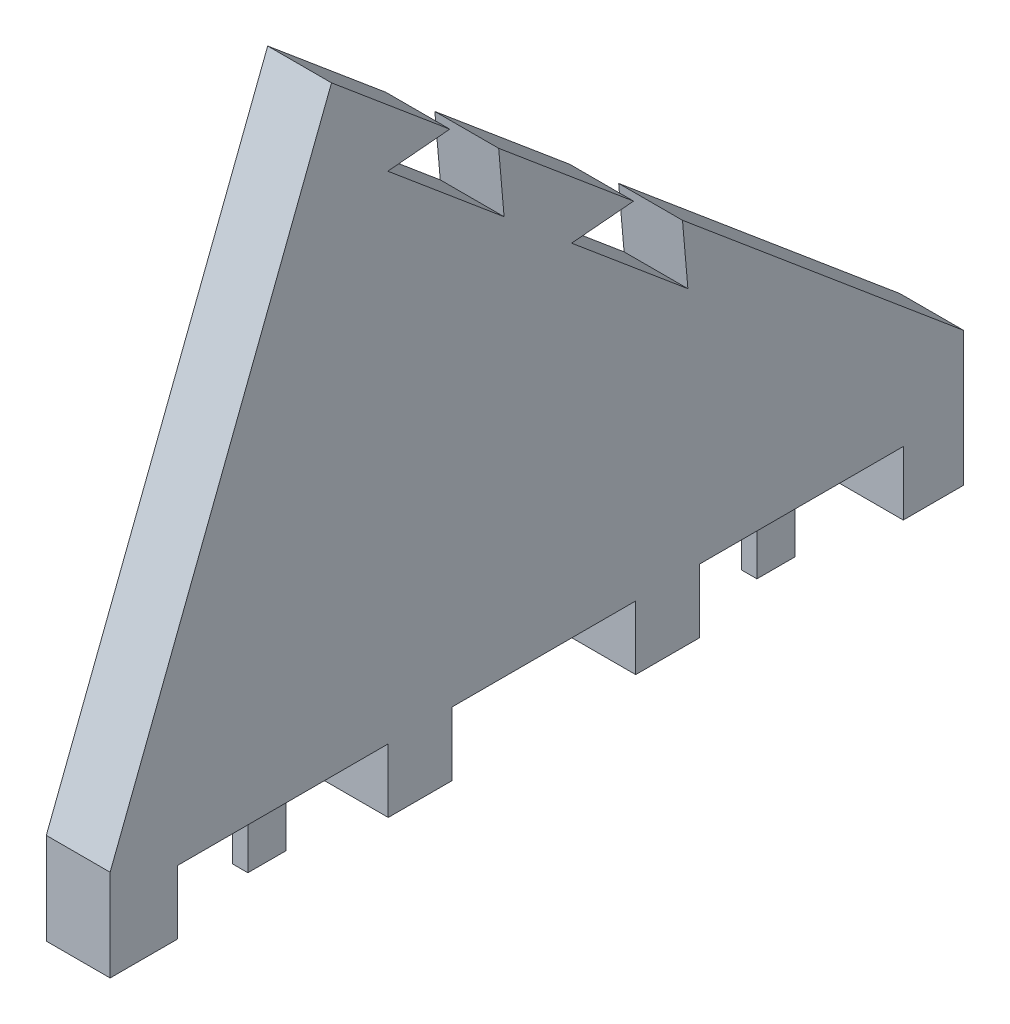
ISO-10303-21;
HEADER;
FILE_DESCRIPTION(('STEP AP214'),'2;1');
FILE_NAME('part.step','',(''),(''),'','','');
FILE_SCHEMA(('AUTOMOTIVE_DESIGN { 1 0 10303 214 1 1 1 1 }'));
ENDSEC;
DATA;
#1=APPLICATION_CONTEXT('core data for automotive mechanical design processes');
#2=APPLICATION_PROTOCOL_DEFINITION('international standard','automotive_design',2000,#1);
#3=PRODUCT_CONTEXT('',#1,'mechanical');
#4=PRODUCT('Part','Part','',(#3));
#5=PRODUCT_RELATED_PRODUCT_CATEGORY('part','',(#4));
#6=PRODUCT_DEFINITION_FORMATION('','',#4);
#7=PRODUCT_DEFINITION_CONTEXT('part definition',#1,'design');
#8=PRODUCT_DEFINITION('design','',#6,#7);
#9=PRODUCT_DEFINITION_SHAPE('','',#8);
#10=(LENGTH_UNIT() NAMED_UNIT(*) SI_UNIT(.MILLI.,.METRE.));
#11=(NAMED_UNIT(*) PLANE_ANGLE_UNIT() SI_UNIT($,.RADIAN.));
#12=(NAMED_UNIT(*) SI_UNIT($,.STERADIAN.) SOLID_ANGLE_UNIT());
#13=UNCERTAINTY_MEASURE_WITH_UNIT(LENGTH_MEASURE(1.E-05),#10,'distance_accuracy_value','');
#14=(GEOMETRIC_REPRESENTATION_CONTEXT(3) GLOBAL_UNCERTAINTY_ASSIGNED_CONTEXT((#13)) GLOBAL_UNIT_ASSIGNED_CONTEXT((#10,
#11,#12)) REPRESENTATION_CONTEXT('',''));
#15=CARTESIAN_POINT('',(0.,0.,0.));
#16=DIRECTION('',(0.,0.,1.));
#17=DIRECTION('',(1.,0.,0.));
#18=AXIS2_PLACEMENT_3D('',#15,#16,#17);
#19=CARTESIAN_POINT('',(5.,4.99883863747764,0.));
#20=DIRECTION('',(0.,1.,0.));
#21=DIRECTION('',(0.,0.,1.));
#22=AXIS2_PLACEMENT_3D('',#19,#20,#21);
#23=PLANE('',#22);
#24=DIRECTION('',(-1.,0.,0.));
#25=VECTOR('',#24,1.);
#26=CARTESIAN_POINT('',(3.25,4.99883863747764,-18.442857145));
#27=LINE('',#26,#25);
#28=CARTESIAN_POINT('',(3.25,4.99883863747764,-18.442857145));
#29=VERTEX_POINT('',#28);
#30=CARTESIAN_POINT('',(2.05,4.99883863747764,-18.442857145));
#31=VERTEX_POINT('',#30);
#32=EDGE_CURVE('E63',#29,#31,#27,.T.);
#33=ORIENTED_EDGE('',*,*,#32,.F.);
#34=DIRECTION('',(0.,0.,-1.));
#35=VECTOR('',#34,1.);
#36=CARTESIAN_POINT('',(3.25,4.99883863747764,0.));
#37=LINE('',#36,#35);
#38=CARTESIAN_POINT('',(3.25,4.99883863747764,-21.442857145));
#39=VERTEX_POINT('',#38);
#40=EDGE_CURVE('E305',#29,#39,#37,.T.);
#41=ORIENTED_EDGE('',*,*,#40,.T.);
#42=DIRECTION('',(-1.,0.,0.));
#43=VECTOR('',#42,1.);
#44=CARTESIAN_POINT('',(3.25,4.99883863747764,-21.442857145));
#45=LINE('',#44,#43);
#46=CARTESIAN_POINT('',(2.05,4.99883863747764,-21.442857145));
#47=VERTEX_POINT('',#46);
#48=EDGE_CURVE('E317',#39,#47,#45,.T.);
#49=ORIENTED_EDGE('',*,*,#48,.T.);
#50=DIRECTION('',(0.,0.,-1.));
#51=VECTOR('',#50,1.);
#52=CARTESIAN_POINT('',(2.05,4.99883863747764,0.));
#53=LINE('',#52,#51);
#54=EDGE_CURVE('E300',#31,#47,#53,.T.);
#55=ORIENTED_EDGE('',*,*,#54,.F.);
#56=EDGE_LOOP('',(#33,#41,#49,#55));
#57=FACE_BOUND('',#56,.T.);
#58=DIRECTION('',(0.,0.,-1.));
#59=VECTOR('',#58,1.);
#60=CARTESIAN_POINT('',(0.,4.99883863747764,0.));
#61=LINE('',#60,#59);
#62=CARTESIAN_POINT('',(0.,4.99883863747765,-12.192857145));
#63=VERTEX_POINT('',#62);
#64=CARTESIAN_POINT('',(0.,4.99883863747764,-28.1589092083321));
#65=VERTEX_POINT('',#64);
#66=EDGE_CURVE('E324',#63,#65,#61,.T.);
#67=ORIENTED_EDGE('',*,*,#66,.T.);
#68=DIRECTION('',(-1.,0.,0.));
#69=VECTOR('',#68,1.);
#70=CARTESIAN_POINT('',(5.,4.99883863747764,-28.1589092083321));
#71=LINE('',#70,#69);
#72=CARTESIAN_POINT('',(5.,4.99883863747764,-28.1589092083321));
#73=VERTEX_POINT('',#72);
#74=EDGE_CURVE('E11',#73,#65,#71,.T.);
#75=ORIENTED_EDGE('',*,*,#74,.F.);
#76=DIRECTION('',(0.,0.,-1.));
#77=VECTOR('',#76,1.);
#78=CARTESIAN_POINT('',(5.,4.99883863747764,0.));
#79=LINE('',#78,#77);
#80=CARTESIAN_POINT('',(5.,4.99883863747765,-12.192857145));
#81=VERTEX_POINT('',#80);
#82=EDGE_CURVE('E325',#81,#73,#79,.T.);
#83=ORIENTED_EDGE('',*,*,#82,.F.);
#84=DIRECTION('',(-1.,0.,0.));
#85=VECTOR('',#84,1.);
#86=CARTESIAN_POINT('',(5.,4.99883863747765,-12.192857145));
#87=LINE('',#86,#85);
#88=EDGE_CURVE('E388',#81,#63,#87,.T.);
#89=ORIENTED_EDGE('',*,*,#88,.T.);
#90=EDGE_LOOP('',(#67,#75,#83,#89));
#91=FACE_BOUND('',#90,.T.);
#92=ADVANCED_FACE('F41',(#57,#91),#23,.F.);
#93=CARTESIAN_POINT('',(5.,0.,-28.1589092083321));
#94=DIRECTION('',(0.,0.,-1.));
#95=DIRECTION('',(-1.,0.,0.));
#96=AXIS2_PLACEMENT_3D('',#93,#94,#95);
#97=PLANE('',#96);
#98=DIRECTION('',(0.,-1.,0.));
#99=VECTOR('',#98,1.);
#100=CARTESIAN_POINT('',(0.,0.,-28.1589092083321));
#101=LINE('',#100,#99);
#102=CARTESIAN_POINT('',(0.,0.00505467967505338,-28.1589092083321));
#103=VERTEX_POINT('',#102);
#104=EDGE_CURVE('E391',#65,#103,#101,.T.);
#105=ORIENTED_EDGE('',*,*,#104,.T.);
#106=DIRECTION('',(-1.,0.,0.));
#107=VECTOR('',#106,1.);
#108=CARTESIAN_POINT('',(5.,0.00505467967505338,-28.1589092083321));
#109=LINE('',#108,#107);
#110=CARTESIAN_POINT('',(5.,0.00505467967505338,-28.1589092083321));
#111=VERTEX_POINT('',#110);
#112=EDGE_CURVE('E48',#111,#103,#109,.T.);
#113=ORIENTED_EDGE('',*,*,#112,.F.);
#114=DIRECTION('',(0.,-1.,0.));
#115=VECTOR('',#114,1.);
#116=CARTESIAN_POINT('',(5.,0.,-28.1589092083321));
#117=LINE('',#116,#115);
#118=EDGE_CURVE('E328',#73,#111,#117,.T.);
#119=ORIENTED_EDGE('',*,*,#118,.F.);
#120=ORIENTED_EDGE('',*,*,#74,.T.);
#121=EDGE_LOOP('',(#105,#113,#119,#120));
#122=FACE_BOUND('',#121,.T.);
#123=ADVANCED_FACE('F528',(#122),#97,.F.);
#124=CARTESIAN_POINT('',(5.,0.00505467967505585,0.));
#125=DIRECTION('',(0.,1.,0.));
#126=DIRECTION('',(0.,0.,1.));
#127=AXIS2_PLACEMENT_3D('',#124,#125,#126);
#128=PLANE('',#127);
#129=DIRECTION('',(0.,0.,-1.));
#130=VECTOR('',#129,1.);
#131=CARTESIAN_POINT('',(0.,0.00505467967505585,0.));
#132=LINE('',#131,#130);
#133=CARTESIAN_POINT('',(0.,0.00505467967505296,-32.892857145));
#134=VERTEX_POINT('',#133);
#135=EDGE_CURVE('E393',#103,#134,#132,.T.);
#136=ORIENTED_EDGE('',*,*,#135,.T.);
#137=DIRECTION('',(-1.,0.,0.));
#138=VECTOR('',#137,1.);
#139=CARTESIAN_POINT('',(5.,0.00505467967505296,-32.892857145));
#140=LINE('',#139,#138);
#141=CARTESIAN_POINT('',(5.,0.00505467967505296,-32.892857145));
#142=VERTEX_POINT('',#141);
#143=EDGE_CURVE('E503',#142,#134,#140,.T.);
#144=ORIENTED_EDGE('',*,*,#143,.F.);
#145=DIRECTION('',(0.,0.,-1.));
#146=VECTOR('',#145,1.);
#147=CARTESIAN_POINT('',(5.,0.00505467967505585,0.));
#148=LINE('',#147,#146);
#149=EDGE_CURVE('E331',#111,#142,#148,.T.);
#150=ORIENTED_EDGE('',*,*,#149,.F.);
#151=ORIENTED_EDGE('',*,*,#112,.T.);
#152=EDGE_LOOP('',(#136,#144,#150,#151));
#153=FACE_BOUND('',#152,.T.);
#154=ADVANCED_FACE('F510',(#153),#128,.F.);
#155=CARTESIAN_POINT('',(5.,0.,-32.892857145));
#156=DIRECTION('',(0.,0.,1.));
#157=DIRECTION('',(1.,0.,0.));
#158=AXIS2_PLACEMENT_3D('',#155,#156,#157);
#159=PLANE('',#158);
#160=DIRECTION('',(0.,1.,0.));
#161=VECTOR('',#160,1.);
#162=CARTESIAN_POINT('',(0.,0.,-32.892857145));
#163=LINE('',#162,#161);
#164=CARTESIAN_POINT('',(0.,10.5094533457025,-32.892857145));
#165=VERTEX_POINT('',#164);
#166=EDGE_CURVE('E395',#134,#165,#163,.T.);
#167=ORIENTED_EDGE('',*,*,#166,.T.);
#168=DIRECTION('',(-1.,0.,0.));
#169=VECTOR('',#168,1.);
#170=CARTESIAN_POINT('',(5.,10.5094533457025,-32.892857145));
#171=LINE('',#170,#169);
#172=CARTESIAN_POINT('',(5.,10.5094533457025,-32.892857145));
#173=VERTEX_POINT('',#172);
#174=EDGE_CURVE('E501',#173,#165,#171,.T.);
#175=ORIENTED_EDGE('',*,*,#174,.F.);
#176=DIRECTION('',(0.,1.,0.));
#177=VECTOR('',#176,1.);
#178=CARTESIAN_POINT('',(5.,0.,-32.892857145));
#179=LINE('',#178,#177);
#180=EDGE_CURVE('E333',#142,#173,#179,.T.);
#181=ORIENTED_EDGE('',*,*,#180,.F.);
#182=ORIENTED_EDGE('',*,*,#143,.T.);
#183=EDGE_LOOP('',(#167,#175,#181,#182));
#184=FACE_BOUND('',#183,.T.);
#185=ADVANCED_FACE('F521',(#184),#159,.F.);
#186=CARTESIAN_POINT('',(5.,22.3637707512892,-18.7654317891398));
#187=DIRECTION('',(0.,0.766044443118982,-0.642787609686534));
#188=DIRECTION('',(0.,0.642787609686534,0.766044443118982));
#189=AXIS2_PLACEMENT_3D('',#186,#187,#188);
#190=PLANE('',#189);
#191=DIRECTION('',(0.,-0.642787609686534,-0.766044443118982));
#192=VECTOR('',#191,1.);
#193=CARTESIAN_POINT('',(0.,22.3637707512892,-18.7654317891398));
#194=LINE('',#193,#192);
#195=CARTESIAN_POINT('',(0.,28.9974016846058,-10.8597782924156));
#196=VERTEX_POINT('',#195);
#197=EDGE_CURVE('E398',#196,#165,#194,.T.);
#198=ORIENTED_EDGE('',*,*,#197,.F.);
#199=DIRECTION('',(-1.,0.,0.));
#200=VECTOR('',#199,1.);
#201=CARTESIAN_POINT('',(5.,28.9974016846058,-10.8597782924156));
#202=LINE('',#201,#200);
#203=CARTESIAN_POINT('',(5.,28.9974016846058,-10.8597782924156));
#204=VERTEX_POINT('',#203);
#205=EDGE_CURVE('E499',#204,#196,#202,.T.);
#206=ORIENTED_EDGE('',*,*,#205,.F.);
#207=DIRECTION('',(0.,-0.642787609686534,-0.766044443118982));
#208=VECTOR('',#207,1.);
#209=CARTESIAN_POINT('',(5.,22.3637707512892,-18.7654317891398));
#210=LINE('',#209,#208);
#211=EDGE_CURVE('E335',#204,#173,#210,.T.);
#212=ORIENTED_EDGE('',*,*,#211,.T.);
#213=ORIENTED_EDGE('',*,*,#174,.T.);
#214=EDGE_LOOP('',(#198,#206,#212,#213));
#215=FACE_BOUND('',#214,.T.);
#216=ADVANCED_FACE('F615',(#215),#190,.T.);
#217=CARTESIAN_POINT('',(5.,1.16315819937103,-13.2949590551943));
#218=DIRECTION('',(0.,0.0871557427476729,-0.996194698091744));
#219=DIRECTION('',(0.,0.996194698091744,0.0871557427476729));
#220=AXIS2_PLACEMENT_3D('',#217,#218,#219);
#221=PLANE('',#220);
#222=DIRECTION('',(0.,-0.996194698091744,-0.0871557427476729));
#223=VECTOR('',#222,1.);
#224=CARTESIAN_POINT('',(0.,1.16315819937103,-13.2949590551943));
#225=LINE('',#224,#223);
#226=CARTESIAN_POINT('',(0.,24.1425242072763,-11.2845250344893));
#227=VERTEX_POINT('',#226);
#228=EDGE_CURVE('E401',#196,#227,#225,.T.);
#229=ORIENTED_EDGE('',*,*,#228,.T.);
#230=DIRECTION('',(-1.,0.,0.));
#231=VECTOR('',#230,1.);
#232=CARTESIAN_POINT('',(5.,24.1425242072763,-11.2845250344893));
#233=LINE('',#232,#231);
#234=CARTESIAN_POINT('',(5.,24.1425242072763,-11.2845250344893));
#235=VERTEX_POINT('',#234);
#236=EDGE_CURVE('E496',#235,#227,#233,.T.);
#237=ORIENTED_EDGE('',*,*,#236,.F.);
#238=DIRECTION('',(0.,-0.996194698091744,-0.0871557427476729));
#239=VECTOR('',#238,1.);
#240=CARTESIAN_POINT('',(5.,1.16315819937103,-13.2949590551943));
#241=LINE('',#240,#239);
#242=EDGE_CURVE('E338',#204,#235,#241,.T.);
#243=ORIENTED_EDGE('',*,*,#242,.F.);
#244=ORIENTED_EDGE('',*,*,#205,.T.);
#245=EDGE_LOOP('',(#229,#237,#243,#244));
#246=FACE_BOUND('',#245,.T.);
#247=ADVANCED_FACE('F617',(#246),#221,.F.);
#248=CARTESIAN_POINT('',(5.,19.7239586415876,-16.5503664215119));
#249=DIRECTION('',(0.,-0.766044443118983,0.642787609686534));
#250=DIRECTION('',(0.,-0.642787609686534,-0.766044443118983));
#251=AXIS2_PLACEMENT_3D('',#248,#249,#250);
#252=PLANE('',#251);
#253=DIRECTION('',(0.,0.642787609686534,0.766044443118983));
#254=VECTOR('',#253,1.);
#255=CARTESIAN_POINT('',(0.,19.7239586415876,-16.5503664215119));
#256=LINE('',#255,#254);
#257=CARTESIAN_POINT('',(0.,31.7865929909647,-2.17467859949115));
#258=VERTEX_POINT('',#257);
#259=EDGE_CURVE('E403',#227,#258,#256,.T.);
#260=ORIENTED_EDGE('',*,*,#259,.T.);
#261=DIRECTION('',(-1.,0.,0.));
#262=VECTOR('',#261,1.);
#263=CARTESIAN_POINT('',(5.,31.7865929909647,-2.17467859949115));
#264=LINE('',#263,#262);
#265=CARTESIAN_POINT('',(5.,31.7865929909647,-2.17467859949115));
#266=VERTEX_POINT('',#265);
#267=EDGE_CURVE('E493',#266,#258,#264,.T.);
#268=ORIENTED_EDGE('',*,*,#267,.F.);
#269=DIRECTION('',(0.,0.642787609686534,0.766044443118983));
#270=VECTOR('',#269,1.);
#271=CARTESIAN_POINT('',(5.,19.7239586415876,-16.5503664215119));
#272=LINE('',#271,#270);
#273=EDGE_CURVE('E340',#235,#266,#272,.T.);
#274=ORIENTED_EDGE('',*,*,#273,.F.);
#275=ORIENTED_EDGE('',*,*,#236,.T.);
#276=EDGE_LOOP('',(#260,#268,#274,#275));
#277=FACE_BOUND('',#276,.T.);
#278=ADVANCED_FACE('F611',(#277),#252,.F.);
#279=CARTESIAN_POINT('',(5.,31.3563236172487,2.74332284635948));
#280=DIRECTION('',(0.,0.996194698091745,0.0871557427476589));
#281=DIRECTION('',(0.,-0.0871557427476589,0.996194698091745));
#282=AXIS2_PLACEMENT_3D('',#279,#280,#281);
#283=PLANE('',#282);
#284=DIRECTION('',(0.,0.0871557427476589,-0.996194698091745));
#285=VECTOR('',#284,1.);
#286=CARTESIAN_POINT('',(0.,31.3563236172487,2.74332284635948));
#287=LINE('',#286,#285);
#288=CARTESIAN_POINT('',(0.,32.2113397330384,-7.02955607682063));
#289=VERTEX_POINT('',#288);
#290=EDGE_CURVE('E405',#258,#289,#287,.T.);
#291=ORIENTED_EDGE('',*,*,#290,.T.);
#292=DIRECTION('',(-1.,0.,0.));
#293=VECTOR('',#292,1.);
#294=CARTESIAN_POINT('',(5.,32.2113397330384,-7.02955607682063));
#295=LINE('',#294,#293);
#296=CARTESIAN_POINT('',(5.,32.2113397330384,-7.02955607682063));
#297=VERTEX_POINT('',#296);
#298=EDGE_CURVE('E491',#297,#289,#295,.T.);
#299=ORIENTED_EDGE('',*,*,#298,.F.);
#300=DIRECTION('',(0.,0.0871557427476589,-0.996194698091745));
#301=VECTOR('',#300,1.);
#302=CARTESIAN_POINT('',(5.,31.3563236172487,2.74332284635948));
#303=LINE('',#302,#301);
#304=EDGE_CURVE('E342',#266,#297,#303,.T.);
#305=ORIENTED_EDGE('',*,*,#304,.F.);
#306=ORIENTED_EDGE('',*,*,#267,.T.);
#307=EDGE_LOOP('',(#291,#299,#305,#306));
#308=FACE_BOUND('',#307,.T.);
#309=ADVANCED_FACE('F607',(#308),#283,.F.);
#310=CARTESIAN_POINT('',(5.,22.3637707512892,-18.7654317891398));
#311=DIRECTION('',(0.,0.766044443118983,-0.642787609686534));
#312=DIRECTION('',(0.,0.642787609686534,0.766044443118983));
#313=AXIS2_PLACEMENT_3D('',#310,#311,#312);
#314=PLANE('',#313);
#315=DIRECTION('',(0.,-0.642787609686534,-0.766044443118983));
#316=VECTOR('',#315,1.);
#317=CARTESIAN_POINT('',(0.,22.3637707512892,-18.7654317891398));
#318=LINE('',#317,#316);
#319=CARTESIAN_POINT('',(0.,41.0818087467126,3.54185723822133));
#320=VERTEX_POINT('',#319);
#321=EDGE_CURVE('E408',#320,#289,#318,.T.);
#322=ORIENTED_EDGE('',*,*,#321,.F.);
#323=DIRECTION('',(-1.,0.,0.));
#324=VECTOR('',#323,1.);
#325=CARTESIAN_POINT('',(5.,41.0818087467126,3.54185723822133));
#326=LINE('',#325,#324);
#327=CARTESIAN_POINT('',(5.,41.0818087467126,3.54185723822133));
#328=VERTEX_POINT('',#327);
#329=EDGE_CURVE('E489',#328,#320,#326,.T.);
#330=ORIENTED_EDGE('',*,*,#329,.F.);
#331=DIRECTION('',(0.,-0.642787609686534,-0.766044443118983));
#332=VECTOR('',#331,1.);
#333=CARTESIAN_POINT('',(5.,22.3637707512892,-18.7654317891398));
#334=LINE('',#333,#332);
#335=EDGE_CURVE('E344',#328,#297,#334,.T.);
#336=ORIENTED_EDGE('',*,*,#335,.T.);
#337=ORIENTED_EDGE('',*,*,#298,.T.);
#338=EDGE_LOOP('',(#322,#330,#336,#337));
#339=FACE_BOUND('',#338,.T.);
#340=ADVANCED_FACE('F602',(#339),#314,.T.);
#341=CARTESIAN_POINT('',(5.,0.00454396510591041,-0.0519377588224709));
#342=DIRECTION('',(0.,-0.0871557427476708,0.996194698091744));
#343=DIRECTION('',(0.,-0.996194698091744,-0.0871557427476708));
#344=AXIS2_PLACEMENT_3D('',#341,#342,#343);
#345=PLANE('',#344);
#346=DIRECTION('',(0.,0.996194698091744,0.0871557427476708));
#347=VECTOR('',#346,1.);
#348=CARTESIAN_POINT('',(0.,0.00454396510591041,-0.0519377588224709));
#349=LINE('',#348,#347);
#350=CARTESIAN_POINT('',(0.,36.2269312693831,3.1171104961476));
#351=VERTEX_POINT('',#350);
#352=EDGE_CURVE('E411',#351,#320,#349,.T.);
#353=ORIENTED_EDGE('',*,*,#352,.F.);
#354=DIRECTION('',(-1.,0.,0.));
#355=VECTOR('',#354,1.);
#356=CARTESIAN_POINT('',(5.,36.2269312693831,3.1171104961476));
#357=LINE('',#356,#355);
#358=CARTESIAN_POINT('',(5.,36.2269312693831,3.1171104961476));
#359=VERTEX_POINT('',#358);
#360=EDGE_CURVE('E487',#359,#351,#357,.T.);
#361=ORIENTED_EDGE('',*,*,#360,.F.);
#362=DIRECTION('',(0.,0.996194698091744,0.0871557427476708));
#363=VECTOR('',#362,1.);
#364=CARTESIAN_POINT('',(5.,0.00454396510591041,-0.0519377588224709));
#365=LINE('',#364,#363);
#366=EDGE_CURVE('E347',#359,#328,#365,.T.);
#367=ORIENTED_EDGE('',*,*,#366,.T.);
#368=ORIENTED_EDGE('',*,*,#329,.T.);
#369=EDGE_LOOP('',(#353,#361,#367,#368));
#370=FACE_BOUND('',#369,.T.);
#371=ADVANCED_FACE('F597',(#370),#345,.T.);
#372=CARTESIAN_POINT('',(5.,19.7239586415876,-16.5503664215119));
#373=DIRECTION('',(0.,0.766044443118982,-0.642787609686534));
#374=DIRECTION('',(0.,0.642787609686534,0.766044443118982));
#375=AXIS2_PLACEMENT_3D('',#372,#373,#374);
#376=PLANE('',#375);
#377=DIRECTION('',(0.,-0.642787609686534,-0.766044443118982));
#378=VECTOR('',#377,1.);
#379=CARTESIAN_POINT('',(0.,19.7239586415876,-16.5503664215119));
#380=LINE('',#379,#378);
#381=CARTESIAN_POINT('',(0.,43.8710000530716,12.2269569311457));
#382=VERTEX_POINT('',#381);
#383=EDGE_CURVE('E414',#382,#351,#380,.T.);
#384=ORIENTED_EDGE('',*,*,#383,.F.);
#385=DIRECTION('',(-1.,0.,0.));
#386=VECTOR('',#385,1.);
#387=CARTESIAN_POINT('',(5.,43.8710000530716,12.2269569311457));
#388=LINE('',#387,#386);
#389=CARTESIAN_POINT('',(5.,43.8710000530716,12.2269569311457));
#390=VERTEX_POINT('',#389);
#391=EDGE_CURVE('E485',#390,#382,#388,.T.);
#392=ORIENTED_EDGE('',*,*,#391,.F.);
#393=DIRECTION('',(0.,-0.642787609686534,-0.766044443118982));
#394=VECTOR('',#393,1.);
#395=CARTESIAN_POINT('',(5.,19.7239586415876,-16.5503664215119));
#396=LINE('',#395,#394);
#397=EDGE_CURVE('E350',#390,#359,#396,.T.);
#398=ORIENTED_EDGE('',*,*,#397,.T.);
#399=ORIENTED_EDGE('',*,*,#360,.T.);
#400=EDGE_LOOP('',(#384,#392,#398,#399));
#401=FACE_BOUND('',#400,.T.);
#402=ADVANCED_FACE('F593',(#401),#376,.T.);
#403=CARTESIAN_POINT('',(5.,44.5993449136205,3.90193708062447));
#404=DIRECTION('',(0.,-0.996194698091745,-0.0871557427476602));
#405=DIRECTION('',(0.,0.0871557427476602,-0.996194698091745));
#406=AXIS2_PLACEMENT_3D('',#403,#404,#405);
#407=PLANE('',#406);
#408=DIRECTION('',(0.,-0.0871557427476602,0.996194698091745));
#409=VECTOR('',#408,1.);
#410=CARTESIAN_POINT('',(0.,44.5993449136205,3.90193708062447));
#411=LINE('',#410,#409);
#412=CARTESIAN_POINT('',(0.,44.2957467951453,7.37207945381625));
#413=VERTEX_POINT('',#412);
#414=EDGE_CURVE('E417',#413,#382,#411,.T.);
#415=ORIENTED_EDGE('',*,*,#414,.F.);
#416=DIRECTION('',(-1.,0.,0.));
#417=VECTOR('',#416,1.);
#418=CARTESIAN_POINT('',(5.,44.2957467951453,7.37207945381625));
#419=LINE('',#418,#417);
#420=CARTESIAN_POINT('',(5.,44.2957467951453,7.37207945381625));
#421=VERTEX_POINT('',#420);
#422=EDGE_CURVE('E483',#421,#413,#419,.T.);
#423=ORIENTED_EDGE('',*,*,#422,.F.);
#424=DIRECTION('',(0.,-0.0871557427476602,0.996194698091745));
#425=VECTOR('',#424,1.);
#426=CARTESIAN_POINT('',(5.,44.5993449136205,3.90193708062447));
#427=LINE('',#426,#425);
#428=EDGE_CURVE('E353',#421,#390,#427,.T.);
#429=ORIENTED_EDGE('',*,*,#428,.T.);
#430=ORIENTED_EDGE('',*,*,#391,.T.);
#431=EDGE_LOOP('',(#415,#423,#429,#430));
#432=FACE_BOUND('',#431,.T.);
#433=ADVANCED_FACE('F589',(#432),#407,.T.);
#434=CARTESIAN_POINT('',(5.,22.3637707512892,-18.7654317891397));
#435=DIRECTION('',(0.,0.766044443118983,-0.642787609686534));
#436=DIRECTION('',(0.,0.642787609686534,0.766044443118983));
#437=AXIS2_PLACEMENT_3D('',#434,#435,#436);
#438=PLANE('',#437);
#439=DIRECTION('',(0.,-0.642787609686534,-0.766044443118983));
#440=VECTOR('',#439,1.);
#441=CARTESIAN_POINT('',(0.,22.3637707512892,-18.7654317891397));
#442=LINE('',#441,#440);
#443=CARTESIAN_POINT('',(0.,52.0711838150504,16.6384844562784));
#444=VERTEX_POINT('',#443);
#445=EDGE_CURVE('E420',#444,#413,#442,.T.);
#446=ORIENTED_EDGE('',*,*,#445,.F.);
#447=DIRECTION('',(-1.,0.,0.));
#448=VECTOR('',#447,1.);
#449=CARTESIAN_POINT('',(5.,52.0711838150504,16.6384844562784));
#450=LINE('',#449,#448);
#451=CARTESIAN_POINT('',(5.,52.0711838150504,16.6384844562784));
#452=VERTEX_POINT('',#451);
#453=EDGE_CURVE('E481',#452,#444,#450,.T.);
#454=ORIENTED_EDGE('',*,*,#453,.F.);
#455=DIRECTION('',(0.,-0.642787609686534,-0.766044443118983));
#456=VECTOR('',#455,1.);
#457=CARTESIAN_POINT('',(5.,22.3637707512892,-18.7654317891397));
#458=LINE('',#457,#456);
#459=EDGE_CURVE('E356',#452,#421,#458,.T.);
#460=ORIENTED_EDGE('',*,*,#459,.T.);
#461=ORIENTED_EDGE('',*,*,#422,.T.);
#462=EDGE_LOOP('',(#446,#454,#460,#461));
#463=FACE_BOUND('',#462,.T.);
#464=ADVANCED_FACE('F585',(#463),#438,.T.);
#465=CARTESIAN_POINT('',(5.,12.358442577524,31.983506920508));
#466=DIRECTION('',(0.,0.360429186226386,0.932786578867956));
#467=DIRECTION('',(0.,-0.932786578867956,0.360429186226386));
#468=AXIS2_PLACEMENT_3D('',#465,#466,#467);
#469=PLANE('',#468);
#470=DIRECTION('',(0.,0.932786578867956,-0.360429186226386));
#471=VECTOR('',#470,1.);
#472=CARTESIAN_POINT('',(0.,12.358442577524,31.983506920508));
#473=LINE('',#472,#471);
#474=CARTESIAN_POINT('',(0.,7.18217750491239,33.9836182536681));
#475=VERTEX_POINT('',#474);
#476=EDGE_CURVE('E423',#475,#444,#473,.T.);
#477=ORIENTED_EDGE('',*,*,#476,.F.);
#478=DIRECTION('',(-1.,0.,0.));
#479=VECTOR('',#478,1.);
#480=CARTESIAN_POINT('',(5.,7.18217750491239,33.9836182536681));
#481=LINE('',#480,#479);
#482=CARTESIAN_POINT('',(5.,7.18217750491239,33.9836182536681));
#483=VERTEX_POINT('',#482);
#484=EDGE_CURVE('E479',#483,#475,#481,.T.);
#485=ORIENTED_EDGE('',*,*,#484,.F.);
#486=DIRECTION('',(0.,0.932786578867956,-0.360429186226386));
#487=VECTOR('',#486,1.);
#488=CARTESIAN_POINT('',(5.,12.358442577524,31.983506920508));
#489=LINE('',#488,#487);
#490=EDGE_CURVE('E359',#483,#452,#489,.T.);
#491=ORIENTED_EDGE('',*,*,#490,.T.);
#492=ORIENTED_EDGE('',*,*,#453,.T.);
#493=EDGE_LOOP('',(#477,#485,#491,#492));
#494=FACE_BOUND('',#493,.T.);
#495=ADVANCED_FACE('F581',(#494),#469,.T.);
#496=CARTESIAN_POINT('',(5.,0.,33.9836182536681));
#497=DIRECTION('',(0.,0.,-1.));
#498=DIRECTION('',(-1.,0.,0.));
#499=AXIS2_PLACEMENT_3D('',#496,#497,#498);
#500=PLANE('',#499);
#501=DIRECTION('',(0.,-1.,0.));
#502=VECTOR('',#501,1.);
#503=CARTESIAN_POINT('',(0.,0.,33.9836182536681));
#504=LINE('',#503,#502);
#505=CARTESIAN_POINT('',(0.,0.00505467967505297,33.9836182536681));
#506=VERTEX_POINT('',#505);
#507=EDGE_CURVE('E426',#475,#506,#504,.T.);
#508=ORIENTED_EDGE('',*,*,#507,.T.);
#509=DIRECTION('',(-1.,0.,0.));
#510=VECTOR('',#509,1.);
#511=CARTESIAN_POINT('',(5.,0.00505467967505297,33.9836182536681));
#512=LINE('',#511,#510);
#513=CARTESIAN_POINT('',(5.,0.00505467967505297,33.9836182536681));
#514=VERTEX_POINT('',#513);
#515=EDGE_CURVE('E476',#514,#506,#512,.T.);
#516=ORIENTED_EDGE('',*,*,#515,.F.);
#517=DIRECTION('',(0.,-1.,0.));
#518=VECTOR('',#517,1.);
#519=CARTESIAN_POINT('',(5.,0.,33.9836182536681));
#520=LINE('',#519,#518);
#521=EDGE_CURVE('E362',#483,#514,#520,.T.);
#522=ORIENTED_EDGE('',*,*,#521,.F.);
#523=ORIENTED_EDGE('',*,*,#484,.T.);
#524=EDGE_LOOP('',(#508,#516,#522,#523));
#525=FACE_BOUND('',#524,.T.);
#526=ADVANCED_FACE('F577',(#525),#500,.F.);
#527=CARTESIAN_POINT('',(5.,0.00505467967505294,0.));
#528=DIRECTION('',(0.,1.,0.));
#529=DIRECTION('',(0.,0.,1.));
#530=AXIS2_PLACEMENT_3D('',#527,#528,#529);
#531=PLANE('',#530);
#532=DIRECTION('',(0.,0.,-1.));
#533=VECTOR('',#532,1.);
#534=CARTESIAN_POINT('',(0.,0.00505467967505294,0.));
#535=LINE('',#534,#533);
#536=CARTESIAN_POINT('',(0.,0.00505467967505335,28.6919277339166));
#537=VERTEX_POINT('',#536);
#538=EDGE_CURVE('E428',#506,#537,#535,.T.);
#539=ORIENTED_EDGE('',*,*,#538,.T.);
#540=DIRECTION('',(-1.,0.,0.));
#541=VECTOR('',#540,1.);
#542=CARTESIAN_POINT('',(5.,0.00505467967505335,28.6919277339166));
#543=LINE('',#542,#541);
#544=CARTESIAN_POINT('',(5.,0.00505467967505335,28.6919277339166));
#545=VERTEX_POINT('',#544);
#546=EDGE_CURVE('E474',#545,#537,#543,.T.);
#547=ORIENTED_EDGE('',*,*,#546,.F.);
#548=DIRECTION('',(0.,0.,-1.));
#549=VECTOR('',#548,1.);
#550=CARTESIAN_POINT('',(5.,0.00505467967505294,0.));
#551=LINE('',#550,#549);
#552=EDGE_CURVE('E364',#514,#545,#551,.T.);
#553=ORIENTED_EDGE('',*,*,#552,.F.);
#554=ORIENTED_EDGE('',*,*,#515,.T.);
#555=EDGE_LOOP('',(#539,#547,#553,#554));
#556=FACE_BOUND('',#555,.T.);
#557=ADVANCED_FACE('F573',(#556),#531,.F.);
#558=CARTESIAN_POINT('',(5.,0.,28.6919277339166));
#559=DIRECTION('',(0.,0.,-1.));
#560=DIRECTION('',(-1.,0.,0.));
#561=AXIS2_PLACEMENT_3D('',#558,#559,#560);
#562=PLANE('',#561);
#563=DIRECTION('',(0.,-1.,0.));
#564=VECTOR('',#563,1.);
#565=CARTESIAN_POINT('',(0.,0.,28.6919277339166));
#566=LINE('',#565,#564);
#567=CARTESIAN_POINT('',(0.,4.99883863747764,28.6919277339166));
#568=VERTEX_POINT('',#567);
#569=EDGE_CURVE('E431',#568,#537,#566,.T.);
#570=ORIENTED_EDGE('',*,*,#569,.F.);
#571=DIRECTION('',(-1.,0.,0.));
#572=VECTOR('',#571,1.);
#573=CARTESIAN_POINT('',(5.,4.99883863747764,28.6919277339166));
#574=LINE('',#573,#572);
#575=CARTESIAN_POINT('',(5.,4.99883863747764,28.6919277339166));
#576=VERTEX_POINT('',#575);
#577=EDGE_CURVE('E472',#576,#568,#574,.T.);
#578=ORIENTED_EDGE('',*,*,#577,.F.);
#579=DIRECTION('',(0.,-1.,0.));
#580=VECTOR('',#579,1.);
#581=CARTESIAN_POINT('',(5.,0.,28.6919277339166));
#582=LINE('',#581,#580);
#583=EDGE_CURVE('E366',#576,#545,#582,.T.);
#584=ORIENTED_EDGE('',*,*,#583,.T.);
#585=ORIENTED_EDGE('',*,*,#546,.T.);
#586=EDGE_LOOP('',(#570,#578,#584,#585));
#587=FACE_BOUND('',#586,.T.);
#588=ADVANCED_FACE('F568',(#587),#562,.T.);
#589=CARTESIAN_POINT('',(5.,4.99883863747764,0.));
#590=DIRECTION('',(0.,-1.,0.));
#591=DIRECTION('',(0.,0.,-1.));
#592=AXIS2_PLACEMENT_3D('',#589,#590,#591);
#593=PLANE('',#592);
#594=DIRECTION('',(0.,0.,1.));
#595=VECTOR('',#594,1.);
#596=CARTESIAN_POINT('',(3.25,4.99883863747764,0.));
#597=LINE('',#596,#595);
#598=CARTESIAN_POINT('',(3.25,4.99883863747764,18.442857145));
#599=VERTEX_POINT('',#598);
#600=CARTESIAN_POINT('',(3.25,4.99883863747764,21.442857145));
#601=VERTEX_POINT('',#600);
#602=EDGE_CURVE('E261',#599,#601,#597,.T.);
#603=ORIENTED_EDGE('',*,*,#602,.F.);
#604=DIRECTION('',(-1.,0.,0.));
#605=VECTOR('',#604,1.);
#606=CARTESIAN_POINT('',(3.25,4.99883863747764,18.442857145));
#607=LINE('',#606,#605);
#608=CARTESIAN_POINT('',(2.05,4.99883863747764,18.442857145));
#609=VERTEX_POINT('',#608);
#610=EDGE_CURVE('E270',#599,#609,#607,.T.);
#611=ORIENTED_EDGE('',*,*,#610,.T.);
#612=DIRECTION('',(0.,0.,1.));
#613=VECTOR('',#612,1.);
#614=CARTESIAN_POINT('',(2.05,4.99883863747764,0.));
#615=LINE('',#614,#613);
#616=CARTESIAN_POINT('',(2.05,4.99883863747764,21.442857145));
#617=VERTEX_POINT('',#616);
#618=EDGE_CURVE('E289',#609,#617,#615,.T.);
#619=ORIENTED_EDGE('',*,*,#618,.T.);
#620=DIRECTION('',(-1.,0.,0.));
#621=VECTOR('',#620,1.);
#622=CARTESIAN_POINT('',(3.25,4.99883863747764,21.442857145));
#623=LINE('',#622,#621);
#624=EDGE_CURVE('E277',#601,#617,#623,.T.);
#625=ORIENTED_EDGE('',*,*,#624,.F.);
#626=EDGE_LOOP('',(#603,#611,#619,#625));
#627=FACE_BOUND('',#626,.T.);
#628=DIRECTION('',(0.,0.,1.));
#629=VECTOR('',#628,1.);
#630=CARTESIAN_POINT('',(0.,4.99883863747764,0.));
#631=LINE('',#630,#629);
#632=CARTESIAN_POINT('',(0.,4.99883863747764,12.192857145));
#633=VERTEX_POINT('',#632);
#634=EDGE_CURVE('E434',#633,#568,#631,.T.);
#635=ORIENTED_EDGE('',*,*,#634,.F.);
#636=DIRECTION('',(-1.,0.,0.));
#637=VECTOR('',#636,1.);
#638=CARTESIAN_POINT('',(5.,4.99883863747764,12.192857145));
#639=LINE('',#638,#637);
#640=CARTESIAN_POINT('',(5.,4.99883863747764,12.192857145));
#641=VERTEX_POINT('',#640);
#642=EDGE_CURVE('E470',#641,#633,#639,.T.);
#643=ORIENTED_EDGE('',*,*,#642,.F.);
#644=DIRECTION('',(0.,0.,1.));
#645=VECTOR('',#644,1.);
#646=CARTESIAN_POINT('',(5.,4.99883863747764,0.));
#647=LINE('',#646,#645);
#648=EDGE_CURVE('E369',#641,#576,#647,.T.);
#649=ORIENTED_EDGE('',*,*,#648,.T.);
#650=ORIENTED_EDGE('',*,*,#577,.T.);
#651=EDGE_LOOP('',(#635,#643,#649,#650));
#652=FACE_BOUND('',#651,.T.);
#653=ADVANCED_FACE('F280',(#627,#652),#593,.T.);
#654=CARTESIAN_POINT('',(5.,0.,12.192857145));
#655=DIRECTION('',(0.,0.,1.));
#656=DIRECTION('',(1.,0.,0.));
#657=AXIS2_PLACEMENT_3D('',#654,#655,#656);
#658=PLANE('',#657);
#659=DIRECTION('',(0.,1.,0.));
#660=VECTOR('',#659,1.);
#661=CARTESIAN_POINT('',(0.,0.,12.192857145));
#662=LINE('',#661,#660);
#663=CARTESIAN_POINT('',(0.,4.16328420696499E-06,12.192857145));
#664=VERTEX_POINT('',#663);
#665=EDGE_CURVE('E437',#664,#633,#662,.T.);
#666=ORIENTED_EDGE('',*,*,#665,.F.);
#667=DIRECTION('',(-1.,0.,0.));
#668=VECTOR('',#667,1.);
#669=CARTESIAN_POINT('',(5.,4.16328420696499E-06,12.192857145));
#670=LINE('',#669,#668);
#671=CARTESIAN_POINT('',(5.,4.16328420696499E-06,12.192857145));
#672=VERTEX_POINT('',#671);
#673=EDGE_CURVE('E468',#672,#664,#670,.T.);
#674=ORIENTED_EDGE('',*,*,#673,.F.);
#675=DIRECTION('',(0.,1.,0.));
#676=VECTOR('',#675,1.);
#677=CARTESIAN_POINT('',(5.,0.,12.192857145));
#678=LINE('',#677,#676);
#679=EDGE_CURVE('E372',#672,#641,#678,.T.);
#680=ORIENTED_EDGE('',*,*,#679,.T.);
#681=ORIENTED_EDGE('',*,*,#642,.T.);
#682=EDGE_LOOP('',(#666,#674,#680,#681));
#683=FACE_BOUND('',#682,.T.);
#684=ADVANCED_FACE('F561',(#683),#658,.T.);
#685=CARTESIAN_POINT('',(5.,4.16328420696499E-06,0.));
#686=DIRECTION('',(0.,1.,0.));
#687=DIRECTION('',(0.,0.,1.));
#688=AXIS2_PLACEMENT_3D('',#685,#686,#687);
#689=PLANE('',#688);
#690=DIRECTION('',(0.,0.,-1.));
#691=VECTOR('',#690,1.);
#692=CARTESIAN_POINT('',(0.,4.16328420696499E-06,0.));
#693=LINE('',#692,#691);
#694=CARTESIAN_POINT('',(0.,4.16328420696499E-06,7.192857145));
#695=VERTEX_POINT('',#694);
#696=EDGE_CURVE('E440',#664,#695,#693,.T.);
#697=ORIENTED_EDGE('',*,*,#696,.T.);
#698=DIRECTION('',(-1.,0.,0.));
#699=VECTOR('',#698,1.);
#700=CARTESIAN_POINT('',(5.,4.16328420696499E-06,7.192857145));
#701=LINE('',#700,#699);
#702=CARTESIAN_POINT('',(5.,4.16328420696499E-06,7.192857145));
#703=VERTEX_POINT('',#702);
#704=EDGE_CURVE('E465',#703,#695,#701,.T.);
#705=ORIENTED_EDGE('',*,*,#704,.F.);
#706=DIRECTION('',(0.,0.,-1.));
#707=VECTOR('',#706,1.);
#708=CARTESIAN_POINT('',(5.,4.16328420696499E-06,0.));
#709=LINE('',#708,#707);
#710=EDGE_CURVE('E375',#672,#703,#709,.T.);
#711=ORIENTED_EDGE('',*,*,#710,.F.);
#712=ORIENTED_EDGE('',*,*,#673,.T.);
#713=EDGE_LOOP('',(#697,#705,#711,#712));
#714=FACE_BOUND('',#713,.T.);
#715=ADVANCED_FACE('F557',(#714),#689,.F.);
#716=CARTESIAN_POINT('',(5.,0.,7.192857145));
#717=DIRECTION('',(0.,0.,1.));
#718=DIRECTION('',(1.,0.,0.));
#719=AXIS2_PLACEMENT_3D('',#716,#717,#718);
#720=PLANE('',#719);
#721=DIRECTION('',(0.,1.,0.));
#722=VECTOR('',#721,1.);
#723=CARTESIAN_POINT('',(0.,0.,7.192857145));
#724=LINE('',#723,#722);
#725=CARTESIAN_POINT('',(0.,5.00000416328421,7.192857145));
#726=VERTEX_POINT('',#725);
#727=EDGE_CURVE('E442',#695,#726,#724,.T.);
#728=ORIENTED_EDGE('',*,*,#727,.T.);
#729=DIRECTION('',(-1.,0.,0.));
#730=VECTOR('',#729,1.);
#731=CARTESIAN_POINT('',(5.,5.00000416328421,7.192857145));
#732=LINE('',#731,#730);
#733=CARTESIAN_POINT('',(5.,5.00000416328421,7.192857145));
#734=VERTEX_POINT('',#733);
#735=EDGE_CURVE('E462',#734,#726,#732,.T.);
#736=ORIENTED_EDGE('',*,*,#735,.F.);
#737=DIRECTION('',(0.,1.,0.));
#738=VECTOR('',#737,1.);
#739=CARTESIAN_POINT('',(5.,0.,7.192857145));
#740=LINE('',#739,#738);
#741=EDGE_CURVE('E377',#703,#734,#740,.T.);
#742=ORIENTED_EDGE('',*,*,#741,.F.);
#743=ORIENTED_EDGE('',*,*,#704,.T.);
#744=EDGE_LOOP('',(#728,#736,#742,#743));
#745=FACE_BOUND('',#744,.T.);
#746=ADVANCED_FACE('F553',(#745),#720,.F.);
#747=CARTESIAN_POINT('',(5.,5.00000416328421,0.));
#748=DIRECTION('',(0.,1.,0.));
#749=DIRECTION('',(0.,0.,1.));
#750=AXIS2_PLACEMENT_3D('',#747,#748,#749);
#751=PLANE('',#750);
#752=DIRECTION('',(0.,0.,-1.));
#753=VECTOR('',#752,1.);
#754=CARTESIAN_POINT('',(0.,5.00000416328421,0.));
#755=LINE('',#754,#753);
#756=CARTESIAN_POINT('',(0.,5.00000416328421,-7.192857145));
#757=VERTEX_POINT('',#756);
#758=EDGE_CURVE('E444',#726,#757,#755,.T.);
#759=ORIENTED_EDGE('',*,*,#758,.T.);
#760=DIRECTION('',(-1.,0.,0.));
#761=VECTOR('',#760,1.);
#762=CARTESIAN_POINT('',(5.,5.00000416328421,-7.192857145));
#763=LINE('',#762,#761);
#764=CARTESIAN_POINT('',(5.,5.00000416328421,-7.192857145));
#765=VERTEX_POINT('',#764);
#766=EDGE_CURVE('E459',#765,#757,#763,.T.);
#767=ORIENTED_EDGE('',*,*,#766,.F.);
#768=DIRECTION('',(0.,0.,-1.));
#769=VECTOR('',#768,1.);
#770=CARTESIAN_POINT('',(5.,5.00000416328421,0.));
#771=LINE('',#770,#769);
#772=EDGE_CURVE('E379',#734,#765,#771,.T.);
#773=ORIENTED_EDGE('',*,*,#772,.F.);
#774=ORIENTED_EDGE('',*,*,#735,.T.);
#775=EDGE_LOOP('',(#759,#767,#773,#774));
#776=FACE_BOUND('',#775,.T.);
#777=ADVANCED_FACE('F548',(#776),#751,.F.);
#778=CARTESIAN_POINT('',(5.,0.,-7.192857145));
#779=DIRECTION('',(0.,0.,-1.));
#780=DIRECTION('',(0.,1.,0.));
#781=AXIS2_PLACEMENT_3D('',#778,#779,#780);
#782=PLANE('',#781);
#783=DIRECTION('',(0.,-1.,0.));
#784=VECTOR('',#783,1.);
#785=CARTESIAN_POINT('',(0.,0.,-7.192857145));
#786=LINE('',#785,#784);
#787=CARTESIAN_POINT('',(0.,5.10201806187171E-06,-7.192857145));
#788=VERTEX_POINT('',#787);
#789=EDGE_CURVE('E446',#757,#788,#786,.T.);
#790=ORIENTED_EDGE('',*,*,#789,.T.);
#791=DIRECTION('',(-1.,0.,0.));
#792=VECTOR('',#791,1.);
#793=CARTESIAN_POINT('',(5.,5.10201806187171E-06,-7.192857145));
#794=LINE('',#793,#792);
#795=CARTESIAN_POINT('',(5.,5.10201806187171E-06,-7.192857145));
#796=VERTEX_POINT('',#795);
#797=EDGE_CURVE('E457',#796,#788,#794,.T.);
#798=ORIENTED_EDGE('',*,*,#797,.F.);
#799=DIRECTION('',(0.,-1.,0.));
#800=VECTOR('',#799,1.);
#801=CARTESIAN_POINT('',(5.,0.,-7.192857145));
#802=LINE('',#801,#800);
#803=EDGE_CURVE('E381',#765,#796,#802,.T.);
#804=ORIENTED_EDGE('',*,*,#803,.F.);
#805=ORIENTED_EDGE('',*,*,#766,.T.);
#806=EDGE_LOOP('',(#790,#798,#804,#805));
#807=FACE_BOUND('',#806,.T.);
#808=ADVANCED_FACE('F542',(#807),#782,.F.);
#809=CARTESIAN_POINT('',(5.,5.10201806099084E-06,0.));
#810=DIRECTION('',(0.,-1.,0.));
#811=DIRECTION('',(0.,0.,-1.));
#812=AXIS2_PLACEMENT_3D('',#809,#810,#811);
#813=PLANE('',#812);
#814=DIRECTION('',(0.,0.,1.));
#815=VECTOR('',#814,1.);
#816=CARTESIAN_POINT('',(0.,5.10201806099084E-06,0.));
#817=LINE('',#816,#815);
#818=CARTESIAN_POINT('',(0.,5.10201806248403E-06,-12.192857145));
#819=VERTEX_POINT('',#818);
#820=EDGE_CURVE('E449',#819,#788,#817,.T.);
#821=ORIENTED_EDGE('',*,*,#820,.F.);
#822=DIRECTION('',(-1.,0.,0.));
#823=VECTOR('',#822,1.);
#824=CARTESIAN_POINT('',(5.,5.10201806248403E-06,-12.192857145));
#825=LINE('',#824,#823);
#826=CARTESIAN_POINT('',(5.,5.10201806248403E-06,-12.192857145));
#827=VERTEX_POINT('',#826);
#828=EDGE_CURVE('E455',#827,#819,#825,.T.);
#829=ORIENTED_EDGE('',*,*,#828,.F.);
#830=DIRECTION('',(0.,0.,1.));
#831=VECTOR('',#830,1.);
#832=CARTESIAN_POINT('',(5.,5.10201806099084E-06,0.));
#833=LINE('',#832,#831);
#834=EDGE_CURVE('E383',#827,#796,#833,.T.);
#835=ORIENTED_EDGE('',*,*,#834,.T.);
#836=ORIENTED_EDGE('',*,*,#797,.T.);
#837=EDGE_LOOP('',(#821,#829,#835,#836));
#838=FACE_BOUND('',#837,.T.);
#839=ADVANCED_FACE('F536',(#838),#813,.T.);
#840=CARTESIAN_POINT('',(5.,0.,-12.192857145));
#841=DIRECTION('',(0.,0.,1.));
#842=DIRECTION('',(1.,0.,0.));
#843=AXIS2_PLACEMENT_3D('',#840,#841,#842);
#844=PLANE('',#843);
#845=DIRECTION('',(0.,1.,0.));
#846=VECTOR('',#845,1.);
#847=CARTESIAN_POINT('',(0.,0.,-12.192857145));
#848=LINE('',#847,#846);
#849=EDGE_CURVE('E329',#819,#63,#848,.T.);
#850=ORIENTED_EDGE('',*,*,#849,.T.);
#851=ORIENTED_EDGE('',*,*,#88,.F.);
#852=DIRECTION('',(0.,1.,0.));
#853=VECTOR('',#852,1.);
#854=CARTESIAN_POINT('',(5.,0.,-12.192857145));
#855=LINE('',#854,#853);
#856=EDGE_CURVE('E386',#827,#81,#855,.T.);
#857=ORIENTED_EDGE('',*,*,#856,.F.);
#858=ORIENTED_EDGE('',*,*,#828,.T.);
#859=EDGE_LOOP('',(#850,#851,#857,#858));
#860=FACE_BOUND('',#859,.T.);
#861=ADVANCED_FACE('F618',(#860),#844,.F.);
#862=CARTESIAN_POINT('',(5.,0.,0.));
#863=DIRECTION('',(1.,0.,0.));
#864=DIRECTION('',(0.,0.,-1.));
#865=AXIS2_PLACEMENT_3D('',#862,#863,#864);
#866=PLANE('',#865);
#867=ORIENTED_EDGE('',*,*,#82,.T.);
#868=ORIENTED_EDGE('',*,*,#118,.T.);
#869=ORIENTED_EDGE('',*,*,#149,.T.);
#870=ORIENTED_EDGE('',*,*,#180,.T.);
#871=ORIENTED_EDGE('',*,*,#211,.F.);
#872=ORIENTED_EDGE('',*,*,#242,.T.);
#873=ORIENTED_EDGE('',*,*,#273,.T.);
#874=ORIENTED_EDGE('',*,*,#304,.T.);
#875=ORIENTED_EDGE('',*,*,#335,.F.);
#876=ORIENTED_EDGE('',*,*,#366,.F.);
#877=ORIENTED_EDGE('',*,*,#397,.F.);
#878=ORIENTED_EDGE('',*,*,#428,.F.);
#879=ORIENTED_EDGE('',*,*,#459,.F.);
#880=ORIENTED_EDGE('',*,*,#490,.F.);
#881=ORIENTED_EDGE('',*,*,#521,.T.);
#882=ORIENTED_EDGE('',*,*,#552,.T.);
#883=ORIENTED_EDGE('',*,*,#583,.F.);
#884=ORIENTED_EDGE('',*,*,#648,.F.);
#885=ORIENTED_EDGE('',*,*,#679,.F.);
#886=ORIENTED_EDGE('',*,*,#710,.T.);
#887=ORIENTED_EDGE('',*,*,#741,.T.);
#888=ORIENTED_EDGE('',*,*,#772,.T.);
#889=ORIENTED_EDGE('',*,*,#803,.T.);
#890=ORIENTED_EDGE('',*,*,#834,.F.);
#891=ORIENTED_EDGE('',*,*,#856,.T.);
#892=EDGE_LOOP('',(#867,#868,#869,#870,#871,#872,#873,#874,#875,#876,#877,#878,#879,#880,#881,
#882,#883,#884,#885,#886,#887,#888,#889,#890,#891));
#893=FACE_BOUND('',#892,.T.);
#894=ADVANCED_FACE('F525',(#893),#866,.T.);
#895=CARTESIAN_POINT('',(0.,0.,0.));
#896=DIRECTION('',(1.,0.,0.));
#897=DIRECTION('',(0.,0.,-1.));
#898=AXIS2_PLACEMENT_3D('',#895,#896,#897);
#899=PLANE('',#898);
#900=ORIENTED_EDGE('',*,*,#66,.F.);
#901=ORIENTED_EDGE('',*,*,#849,.F.);
#902=ORIENTED_EDGE('',*,*,#820,.T.);
#903=ORIENTED_EDGE('',*,*,#789,.F.);
#904=ORIENTED_EDGE('',*,*,#758,.F.);
#905=ORIENTED_EDGE('',*,*,#727,.F.);
#906=ORIENTED_EDGE('',*,*,#696,.F.);
#907=ORIENTED_EDGE('',*,*,#665,.T.);
#908=ORIENTED_EDGE('',*,*,#634,.T.);
#909=ORIENTED_EDGE('',*,*,#569,.T.);
#910=ORIENTED_EDGE('',*,*,#538,.F.);
#911=ORIENTED_EDGE('',*,*,#507,.F.);
#912=ORIENTED_EDGE('',*,*,#476,.T.);
#913=ORIENTED_EDGE('',*,*,#445,.T.);
#914=ORIENTED_EDGE('',*,*,#414,.T.);
#915=ORIENTED_EDGE('',*,*,#383,.T.);
#916=ORIENTED_EDGE('',*,*,#352,.T.);
#917=ORIENTED_EDGE('',*,*,#321,.T.);
#918=ORIENTED_EDGE('',*,*,#290,.F.);
#919=ORIENTED_EDGE('',*,*,#259,.F.);
#920=ORIENTED_EDGE('',*,*,#228,.F.);
#921=ORIENTED_EDGE('',*,*,#197,.T.);
#922=ORIENTED_EDGE('',*,*,#166,.F.);
#923=ORIENTED_EDGE('',*,*,#135,.F.);
#924=ORIENTED_EDGE('',*,*,#104,.F.);
#925=EDGE_LOOP('',(#900,#901,#902,#903,#904,#905,#906,#907,#908,#909,#910,#911,#912,#913,#914,
#915,#916,#917,#918,#919,#920,#921,#922,#923,#924));
#926=FACE_BOUND('',#925,.T.);
#927=ADVANCED_FACE('F516',(#926),#899,.F.);
#928=CARTESIAN_POINT('',(3.25,0.,-18.442857145));
#929=DIRECTION('',(0.,0.,1.));
#930=DIRECTION('',(1.,0.,0.));
#931=AXIS2_PLACEMENT_3D('',#928,#929,#930);
#932=PLANE('',#931);
#933=DIRECTION('',(0.,1.,0.));
#934=VECTOR('',#933,1.);
#935=CARTESIAN_POINT('',(2.05,0.,-18.442857145));
#936=LINE('',#935,#934);
#937=CARTESIAN_POINT('',(2.05,-0.00116136252235704,-18.442857145));
#938=VERTEX_POINT('',#937);
#939=EDGE_CURVE('E276',#938,#31,#936,.T.);
#940=ORIENTED_EDGE('',*,*,#939,.F.);
#941=DIRECTION('',(-1.,0.,0.));
#942=VECTOR('',#941,1.);
#943=CARTESIAN_POINT('',(3.25,-0.00116136252235704,-18.442857145));
#944=LINE('',#943,#942);
#945=CARTESIAN_POINT('',(3.25,-0.00116136252235704,-18.442857145));
#946=VERTEX_POINT('',#945);
#947=EDGE_CURVE('E322',#946,#938,#944,.T.);
#948=ORIENTED_EDGE('',*,*,#947,.F.);
#949=DIRECTION('',(0.,1.,0.));
#950=VECTOR('',#949,1.);
#951=CARTESIAN_POINT('',(3.25,0.,-18.442857145));
#952=LINE('',#951,#950);
#953=EDGE_CURVE('E297',#946,#29,#952,.T.);
#954=ORIENTED_EDGE('',*,*,#953,.T.);
#955=ORIENTED_EDGE('',*,*,#32,.T.);
#956=EDGE_LOOP('',(#940,#948,#954,#955));
#957=FACE_BOUND('',#956,.T.);
#958=ADVANCED_FACE('F704',(#957),#932,.T.);
#959=CARTESIAN_POINT('',(3.25,-0.00116136252235478,0.));
#960=DIRECTION('',(0.,1.,0.));
#961=DIRECTION('',(0.,0.,1.));
#962=AXIS2_PLACEMENT_3D('',#959,#960,#961);
#963=PLANE('',#962);
#964=DIRECTION('',(0.,0.,-1.));
#965=VECTOR('',#964,1.);
#966=CARTESIAN_POINT('',(2.05,-0.00116136252235478,0.));
#967=LINE('',#966,#965);
#968=CARTESIAN_POINT('',(2.05,-0.00116136252235741,-21.442857145));
#969=VERTEX_POINT('',#968);
#970=EDGE_CURVE('E309',#938,#969,#967,.T.);
#971=ORIENTED_EDGE('',*,*,#970,.T.);
#972=DIRECTION('',(-1.,0.,0.));
#973=VECTOR('',#972,1.);
#974=CARTESIAN_POINT('',(3.25,-0.00116136252235741,-21.442857145));
#975=LINE('',#974,#973);
#976=CARTESIAN_POINT('',(3.25,-0.00116136252235741,-21.442857145));
#977=VERTEX_POINT('',#976);
#978=EDGE_CURVE('E319',#977,#969,#975,.T.);
#979=ORIENTED_EDGE('',*,*,#978,.F.);
#980=DIRECTION('',(0.,0.,-1.));
#981=VECTOR('',#980,1.);
#982=CARTESIAN_POINT('',(3.25,-0.00116136252235478,0.));
#983=LINE('',#982,#981);
#984=EDGE_CURVE('E299',#946,#977,#983,.T.);
#985=ORIENTED_EDGE('',*,*,#984,.F.);
#986=ORIENTED_EDGE('',*,*,#947,.T.);
#987=EDGE_LOOP('',(#971,#979,#985,#986));
#988=FACE_BOUND('',#987,.T.);
#989=ADVANCED_FACE('F727',(#988),#963,.F.);
#990=CARTESIAN_POINT('',(3.25,0.,-21.442857145));
#991=DIRECTION('',(0.,0.,1.));
#992=DIRECTION('',(1.,0.,0.));
#993=AXIS2_PLACEMENT_3D('',#990,#991,#992);
#994=PLANE('',#993);
#995=DIRECTION('',(0.,1.,0.));
#996=VECTOR('',#995,1.);
#997=CARTESIAN_POINT('',(2.05,0.,-21.442857145));
#998=LINE('',#997,#996);
#999=EDGE_CURVE('E311',#969,#47,#998,.T.);
#1000=ORIENTED_EDGE('',*,*,#999,.T.);
#1001=ORIENTED_EDGE('',*,*,#48,.F.);
#1002=DIRECTION('',(0.,1.,0.));
#1003=VECTOR('',#1002,1.);
#1004=CARTESIAN_POINT('',(3.25,0.,-21.442857145));
#1005=LINE('',#1004,#1003);
#1006=EDGE_CURVE('E302',#977,#39,#1005,.T.);
#1007=ORIENTED_EDGE('',*,*,#1006,.F.);
#1008=ORIENTED_EDGE('',*,*,#978,.T.);
#1009=EDGE_LOOP('',(#1000,#1001,#1007,#1008));
#1010=FACE_BOUND('',#1009,.T.);
#1011=ADVANCED_FACE('F737',(#1010),#994,.F.);
#1012=CARTESIAN_POINT('',(3.25,0.,0.));
#1013=DIRECTION('',(1.,0.,0.));
#1014=DIRECTION('',(0.,0.,-1.));
#1015=AXIS2_PLACEMENT_3D('',#1012,#1013,#1014);
#1016=PLANE('',#1015);
#1017=ORIENTED_EDGE('',*,*,#953,.F.);
#1018=ORIENTED_EDGE('',*,*,#984,.T.);
#1019=ORIENTED_EDGE('',*,*,#1006,.T.);
#1020=ORIENTED_EDGE('',*,*,#40,.F.);
#1021=EDGE_LOOP('',(#1017,#1018,#1019,#1020));
#1022=FACE_BOUND('',#1021,.T.);
#1023=ADVANCED_FACE('F747',(#1022),#1016,.T.);
#1024=CARTESIAN_POINT('',(2.05,0.,0.));
#1025=DIRECTION('',(1.,0.,0.));
#1026=DIRECTION('',(0.,0.,-1.));
#1027=AXIS2_PLACEMENT_3D('',#1024,#1025,#1026);
#1028=PLANE('',#1027);
#1029=ORIENTED_EDGE('',*,*,#939,.T.);
#1030=ORIENTED_EDGE('',*,*,#54,.T.);
#1031=ORIENTED_EDGE('',*,*,#999,.F.);
#1032=ORIENTED_EDGE('',*,*,#970,.F.);
#1033=EDGE_LOOP('',(#1029,#1030,#1031,#1032));
#1034=FACE_BOUND('',#1033,.T.);
#1035=ADVANCED_FACE('F757',(#1034),#1028,.F.);
#1036=CARTESIAN_POINT('',(3.25,0.,18.442857145));
#1037=DIRECTION('',(0.,0.,1.));
#1038=DIRECTION('',(1.,0.,0.));
#1039=AXIS2_PLACEMENT_3D('',#1036,#1037,#1038);
#1040=PLANE('',#1039);
#1041=DIRECTION('',(0.,1.,0.));
#1042=VECTOR('',#1041,1.);
#1043=CARTESIAN_POINT('',(2.05,0.,18.442857145));
#1044=LINE('',#1043,#1042);
#1045=CARTESIAN_POINT('',(2.05,-0.00116136252235704,18.442857145));
#1046=VERTEX_POINT('',#1045);
#1047=EDGE_CURVE('E273',#1046,#609,#1044,.T.);
#1048=ORIENTED_EDGE('',*,*,#1047,.T.);
#1049=ORIENTED_EDGE('',*,*,#610,.F.);
#1050=DIRECTION('',(0.,1.,0.));
#1051=VECTOR('',#1050,1.);
#1052=CARTESIAN_POINT('',(3.25,0.,18.442857145));
#1053=LINE('',#1052,#1051);
#1054=CARTESIAN_POINT('',(3.25,-0.00116136252235704,18.442857145));
#1055=VERTEX_POINT('',#1054);
#1056=EDGE_CURVE('E256',#1055,#599,#1053,.T.);
#1057=ORIENTED_EDGE('',*,*,#1056,.F.);
#1058=DIRECTION('',(-1.,0.,0.));
#1059=VECTOR('',#1058,1.);
#1060=CARTESIAN_POINT('',(3.25,-0.00116136252235704,18.442857145));
#1061=LINE('',#1060,#1059);
#1062=EDGE_CURVE('E287',#1055,#1046,#1061,.T.);
#1063=ORIENTED_EDGE('',*,*,#1062,.T.);
#1064=EDGE_LOOP('',(#1048,#1049,#1057,#1063));
#1065=FACE_BOUND('',#1064,.T.);
#1066=ADVANCED_FACE('F271',(#1065),#1040,.F.);
#1067=CARTESIAN_POINT('',(3.25,0.,21.442857145));
#1068=DIRECTION('',(0.,0.,1.));
#1069=DIRECTION('',(1.,0.,0.));
#1070=AXIS2_PLACEMENT_3D('',#1067,#1068,#1069);
#1071=PLANE('',#1070);
#1072=DIRECTION('',(0.,1.,0.));
#1073=VECTOR('',#1072,1.);
#1074=CARTESIAN_POINT('',(2.05,0.,21.442857145));
#1075=LINE('',#1074,#1073);
#1076=CARTESIAN_POINT('',(2.05,-0.00116136252235741,21.442857145));
#1077=VERTEX_POINT('',#1076);
#1078=EDGE_CURVE('E55',#1077,#617,#1075,.T.);
#1079=ORIENTED_EDGE('',*,*,#1078,.F.);
#1080=DIRECTION('',(-1.,0.,0.));
#1081=VECTOR('',#1080,1.);
#1082=CARTESIAN_POINT('',(3.25,-0.00116136252235741,21.442857145));
#1083=LINE('',#1082,#1081);
#1084=CARTESIAN_POINT('',(3.25,-0.00116136252235741,21.442857145));
#1085=VERTEX_POINT('',#1084);
#1086=EDGE_CURVE('E294',#1085,#1077,#1083,.T.);
#1087=ORIENTED_EDGE('',*,*,#1086,.F.);
#1088=DIRECTION('',(0.,1.,0.));
#1089=VECTOR('',#1088,1.);
#1090=CARTESIAN_POINT('',(3.25,0.,21.442857145));
#1091=LINE('',#1090,#1089);
#1092=EDGE_CURVE('E282',#1085,#601,#1091,.T.);
#1093=ORIENTED_EDGE('',*,*,#1092,.T.);
#1094=ORIENTED_EDGE('',*,*,#624,.T.);
#1095=EDGE_LOOP('',(#1079,#1087,#1093,#1094));
#1096=FACE_BOUND('',#1095,.T.);
#1097=ADVANCED_FACE('F776',(#1096),#1071,.T.);
#1098=CARTESIAN_POINT('',(3.25,-0.00116136252235478,0.));
#1099=DIRECTION('',(0.,-1.,0.));
#1100=DIRECTION('',(0.,0.,-1.));
#1101=AXIS2_PLACEMENT_3D('',#1098,#1099,#1100);
#1102=PLANE('',#1101);
#1103=DIRECTION('',(0.,0.,1.));
#1104=VECTOR('',#1103,1.);
#1105=CARTESIAN_POINT('',(2.05,-0.00116136252235478,0.));
#1106=LINE('',#1105,#1104);
#1107=EDGE_CURVE('E266',#1046,#1077,#1106,.T.);
#1108=ORIENTED_EDGE('',*,*,#1107,.F.);
#1109=ORIENTED_EDGE('',*,*,#1062,.F.);
#1110=DIRECTION('',(0.,0.,1.));
#1111=VECTOR('',#1110,1.);
#1112=CARTESIAN_POINT('',(3.25,-0.00116136252235478,0.));
#1113=LINE('',#1112,#1111);
#1114=EDGE_CURVE('E264',#1055,#1085,#1113,.T.);
#1115=ORIENTED_EDGE('',*,*,#1114,.T.);
#1116=ORIENTED_EDGE('',*,*,#1086,.T.);
#1117=EDGE_LOOP('',(#1108,#1109,#1115,#1116));
#1118=FACE_BOUND('',#1117,.T.);
#1119=ADVANCED_FACE('F785',(#1118),#1102,.T.);
#1120=CARTESIAN_POINT('',(3.25,0.,0.));
#1121=DIRECTION('',(1.,0.,0.));
#1122=DIRECTION('',(0.,0.,-1.));
#1123=AXIS2_PLACEMENT_3D('',#1120,#1121,#1122);
#1124=PLANE('',#1123);
#1125=ORIENTED_EDGE('',*,*,#1056,.T.);
#1126=ORIENTED_EDGE('',*,*,#602,.T.);
#1127=ORIENTED_EDGE('',*,*,#1092,.F.);
#1128=ORIENTED_EDGE('',*,*,#1114,.F.);
#1129=EDGE_LOOP('',(#1125,#1126,#1127,#1128));
#1130=FACE_BOUND('',#1129,.T.);
#1131=ADVANCED_FACE('F258',(#1130),#1124,.T.);
#1132=CARTESIAN_POINT('',(2.05,0.,0.));
#1133=DIRECTION('',(1.,0.,0.));
#1134=DIRECTION('',(0.,0.,-1.));
#1135=AXIS2_PLACEMENT_3D('',#1132,#1133,#1134);
#1136=PLANE('',#1135);
#1137=ORIENTED_EDGE('',*,*,#1047,.F.);
#1138=ORIENTED_EDGE('',*,*,#1107,.T.);
#1139=ORIENTED_EDGE('',*,*,#1078,.T.);
#1140=ORIENTED_EDGE('',*,*,#618,.F.);
#1141=EDGE_LOOP('',(#1137,#1138,#1139,#1140));
#1142=FACE_BOUND('',#1141,.T.);
#1143=ADVANCED_FACE('F804',(#1142),#1136,.F.);
#1144=CLOSED_SHELL('',(#92,#123,#154,#185,#216,#247,#278,#309,#340,#371,#402,#433,#464,#495,
#526,#557,#588,#653,#684,#715,#746,#777,#808,#839,#861,#894,#927,#958,#989,#1011,#1023,#1035,
#1066,#1097,#1119,#1131,#1143));
#1145=MANIFOLD_SOLID_BREP('B2',#1144);
#1146=ADVANCED_BREP_SHAPE_REPRESENTATION('',(#18,#1145),#14);
#1147=SHAPE_DEFINITION_REPRESENTATION(#9,#1146);
ENDSEC;
END-ISO-10303-21;
